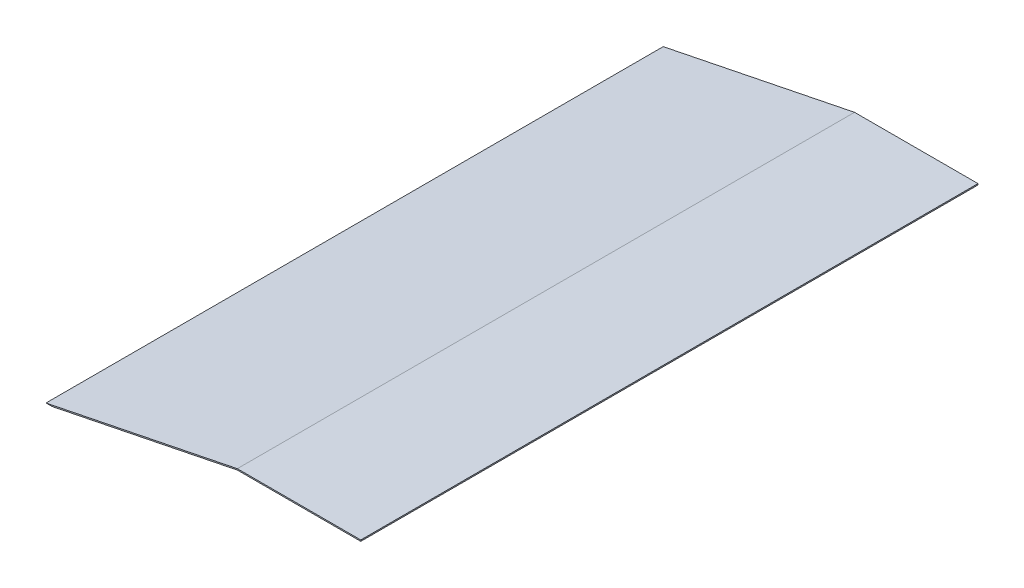
ISO-10303-21;
HEADER;
FILE_DESCRIPTION(('STEP AP214'),'2;1');
FILE_NAME('part.step','',(''),(''),'','','');
FILE_SCHEMA(('AUTOMOTIVE_DESIGN { 1 0 10303 214 1 1 1 1 }'));
ENDSEC;
DATA;
#1=APPLICATION_CONTEXT('core data for automotive mechanical design processes');
#2=APPLICATION_PROTOCOL_DEFINITION('international standard','automotive_design',2000,#1);
#3=PRODUCT_CONTEXT('',#1,'mechanical');
#4=PRODUCT('Part','Part','',(#3));
#5=PRODUCT_RELATED_PRODUCT_CATEGORY('part','',(#4));
#6=PRODUCT_DEFINITION_FORMATION('','',#4);
#7=PRODUCT_DEFINITION_CONTEXT('part definition',#1,'design');
#8=PRODUCT_DEFINITION('design','',#6,#7);
#9=PRODUCT_DEFINITION_SHAPE('','',#8);
#10=(LENGTH_UNIT() NAMED_UNIT(*) SI_UNIT(.MILLI.,.METRE.));
#11=(NAMED_UNIT(*) PLANE_ANGLE_UNIT() SI_UNIT($,.RADIAN.));
#12=(NAMED_UNIT(*) SI_UNIT($,.STERADIAN.) SOLID_ANGLE_UNIT());
#13=UNCERTAINTY_MEASURE_WITH_UNIT(LENGTH_MEASURE(1.E-05),#10,'distance_accuracy_value','');
#14=(GEOMETRIC_REPRESENTATION_CONTEXT(3) GLOBAL_UNCERTAINTY_ASSIGNED_CONTEXT((#13)) GLOBAL_UNIT_ASSIGNED_CONTEXT((#10,
#11,#12)) REPRESENTATION_CONTEXT('',''));
#15=CARTESIAN_POINT('',(0.,0.,0.));
#16=DIRECTION('',(0.,0.,1.));
#17=DIRECTION('',(1.,0.,0.));
#18=AXIS2_PLACEMENT_3D('',#15,#16,#17);
#19=CARTESIAN_POINT('',(0.,6.08130106525994,100.));
#20=DIRECTION('',(-1.,0.,0.));
#21=DIRECTION('',(0.,-1.,0.));
#22=AXIS2_PLACEMENT_3D('',#19,#20,#21);
#23=PLANE('',#22);
#24=DIRECTION('',(0.,1.,0.));
#25=VECTOR('',#24,1.);
#26=CARTESIAN_POINT('',(0.,6.08130106525994,0.));
#27=LINE('',#26,#25);
#28=CARTESIAN_POINT('',(0.,6.08130106525994,0.));
#29=VERTEX_POINT('',#28);
#30=CARTESIAN_POINT('',(0.,6.28401110076863,0.));
#31=VERTEX_POINT('',#30);
#32=EDGE_CURVE('E128',#29,#31,#27,.T.);
#33=ORIENTED_EDGE('',*,*,#32,.T.);
#34=DIRECTION('',(0.,0.,-1.));
#35=VECTOR('',#34,1.);
#36=CARTESIAN_POINT('',(0.,6.28401110076863,100.));
#37=LINE('',#36,#35);
#38=CARTESIAN_POINT('',(0.,6.28401110076863,100.));
#39=VERTEX_POINT('',#38);
#40=EDGE_CURVE('E11',#39,#31,#37,.T.);
#41=ORIENTED_EDGE('',*,*,#40,.F.);
#42=DIRECTION('',(0.,1.,0.));
#43=VECTOR('',#42,1.);
#44=CARTESIAN_POINT('',(0.,6.08130106525994,100.));
#45=LINE('',#44,#43);
#46=CARTESIAN_POINT('',(0.,6.08130106525994,100.));
#47=VERTEX_POINT('',#46);
#48=EDGE_CURVE('E144',#47,#39,#45,.T.);
#49=ORIENTED_EDGE('',*,*,#48,.F.);
#50=DIRECTION('',(0.,0.,-1.));
#51=VECTOR('',#50,1.);
#52=CARTESIAN_POINT('',(0.,6.08130106525994,100.));
#53=LINE('',#52,#51);
#54=EDGE_CURVE('E124',#47,#29,#53,.T.);
#55=ORIENTED_EDGE('',*,*,#54,.T.);
#56=EDGE_LOOP('',(#33,#41,#49,#55));
#57=FACE_BOUND('',#56,.T.);
#58=ADVANCED_FACE('F39',(#57),#23,.F.);
#59=CARTESIAN_POINT('',(0.,6.28401110076863,100.));
#60=DIRECTION('',(0.,-1.,0.));
#61=DIRECTION('',(1.,0.,0.));
#62=AXIS2_PLACEMENT_3D('',#59,#60,#61);
#63=PLANE('',#62);
#64=DIRECTION('',(-1.,0.,0.));
#65=VECTOR('',#64,1.);
#66=CARTESIAN_POINT('',(0.,6.28401110076863,0.));
#67=LINE('',#66,#65);
#68=CARTESIAN_POINT('',(-20.,6.28401110076862,0.));
#69=VERTEX_POINT('',#68);
#70=EDGE_CURVE('E132',#31,#69,#67,.T.);
#71=ORIENTED_EDGE('',*,*,#70,.T.);
#72=DIRECTION('',(0.,0.,-1.));
#73=VECTOR('',#72,1.);
#74=CARTESIAN_POINT('',(-20.,6.28401110076862,100.));
#75=LINE('',#74,#73);
#76=CARTESIAN_POINT('',(-20.,6.28401110076862,100.));
#77=VERTEX_POINT('',#76);
#78=EDGE_CURVE('E48',#77,#69,#75,.T.);
#79=ORIENTED_EDGE('',*,*,#78,.F.);
#80=DIRECTION('',(-1.,0.,0.));
#81=VECTOR('',#80,1.);
#82=CARTESIAN_POINT('',(0.,6.28401110076863,100.));
#83=LINE('',#82,#81);
#84=EDGE_CURVE('E93',#39,#77,#83,.T.);
#85=ORIENTED_EDGE('',*,*,#84,.F.);
#86=ORIENTED_EDGE('',*,*,#40,.T.);
#87=EDGE_LOOP('',(#71,#79,#85,#86));
#88=FACE_BOUND('',#87,.T.);
#89=ADVANCED_FACE('F172',(#88),#63,.F.);
#90=CARTESIAN_POINT('',(-51.,0.,100.));
#91=DIRECTION('',(0.198669330795054,-0.980066577841243,0.));
#92=DIRECTION('',(0.980066577841243,0.198669330795054,0.));
#93=AXIS2_PLACEMENT_3D('',#90,#91,#92);
#94=PLANE('',#93);
#95=DIRECTION('',(-0.980066577841243,-0.198669330795054,0.));
#96=VECTOR('',#95,1.);
#97=CARTESIAN_POINT('',(-51.,0.,0.));
#98=LINE('',#97,#96);
#99=CARTESIAN_POINT('',(-51.,0.,0.));
#100=VERTEX_POINT('',#99);
#101=EDGE_CURVE('E135',#69,#100,#98,.T.);
#102=ORIENTED_EDGE('',*,*,#101,.T.);
#103=DIRECTION('',(0.,0.,-1.));
#104=VECTOR('',#103,1.);
#105=CARTESIAN_POINT('',(-51.,0.,100.));
#106=LINE('',#105,#104);
#107=CARTESIAN_POINT('',(-51.,0.,100.));
#108=VERTEX_POINT('',#107);
#109=EDGE_CURVE('E117',#108,#100,#106,.T.);
#110=ORIENTED_EDGE('',*,*,#109,.F.);
#111=DIRECTION('',(-0.980066577841243,-0.198669330795054,0.));
#112=VECTOR('',#111,1.);
#113=CARTESIAN_POINT('',(-51.,0.,100.));
#114=LINE('',#113,#112);
#115=EDGE_CURVE('E106',#77,#108,#114,.T.);
#116=ORIENTED_EDGE('',*,*,#115,.F.);
#117=ORIENTED_EDGE('',*,*,#78,.T.);
#118=EDGE_LOOP('',(#102,#110,#116,#117));
#119=FACE_BOUND('',#118,.T.);
#120=ADVANCED_FACE('F154',(#119),#94,.F.);
#121=CARTESIAN_POINT('',(-50.,0.,100.));
#122=DIRECTION('',(0.,1.,0.));
#123=DIRECTION('',(-1.,0.,0.));
#124=AXIS2_PLACEMENT_3D('',#121,#122,#123);
#125=PLANE('',#124);
#126=DIRECTION('',(1.,0.,0.));
#127=VECTOR('',#126,1.);
#128=CARTESIAN_POINT('',(-50.,0.,0.));
#129=LINE('',#128,#127);
#130=CARTESIAN_POINT('',(-50.,0.,0.));
#131=VERTEX_POINT('',#130);
#132=EDGE_CURVE('E115',#100,#131,#129,.T.);
#133=ORIENTED_EDGE('',*,*,#132,.T.);
#134=DIRECTION('',(0.,0.,-1.));
#135=VECTOR('',#134,1.);
#136=CARTESIAN_POINT('',(-50.,0.,100.));
#137=LINE('',#136,#135);
#138=CARTESIAN_POINT('',(-50.,0.,100.));
#139=VERTEX_POINT('',#138);
#140=EDGE_CURVE('E112',#139,#131,#137,.T.);
#141=ORIENTED_EDGE('',*,*,#140,.F.);
#142=DIRECTION('',(1.,0.,0.));
#143=VECTOR('',#142,1.);
#144=CARTESIAN_POINT('',(-50.,0.,100.));
#145=LINE('',#144,#143);
#146=EDGE_CURVE('E100',#108,#139,#145,.T.);
#147=ORIENTED_EDGE('',*,*,#146,.F.);
#148=ORIENTED_EDGE('',*,*,#109,.T.);
#149=EDGE_LOOP('',(#133,#141,#147,#148));
#150=FACE_BOUND('',#149,.T.);
#151=ADVANCED_FACE('F113',(#150),#125,.F.);
#152=CARTESIAN_POINT('',(-50.,0.,100.));
#153=DIRECTION('',(-0.198669330795054,0.980066577841243,0.));
#154=DIRECTION('',(-0.980066577841243,-0.198669330795054,0.));
#155=AXIS2_PLACEMENT_3D('',#152,#153,#154);
#156=PLANE('',#155);
#157=DIRECTION('',(0.980066577841243,0.198669330795054,0.));
#158=VECTOR('',#157,1.);
#159=CARTESIAN_POINT('',(-50.,0.,0.));
#160=LINE('',#159,#158);
#161=CARTESIAN_POINT('',(-20.,6.08130106525995,0.));
#162=VERTEX_POINT('',#161);
#163=EDGE_CURVE('E79',#131,#162,#160,.T.);
#164=ORIENTED_EDGE('',*,*,#163,.T.);
#165=DIRECTION('',(0.,0.,-1.));
#166=VECTOR('',#165,1.);
#167=CARTESIAN_POINT('',(-20.,6.08130106525995,100.));
#168=LINE('',#167,#166);
#169=CARTESIAN_POINT('',(-20.,6.08130106525995,100.));
#170=VERTEX_POINT('',#169);
#171=EDGE_CURVE('E118',#170,#162,#168,.T.);
#172=ORIENTED_EDGE('',*,*,#171,.F.);
#173=DIRECTION('',(0.980066577841243,0.198669330795054,0.));
#174=VECTOR('',#173,1.);
#175=CARTESIAN_POINT('',(-50.,0.,100.));
#176=LINE('',#175,#174);
#177=EDGE_CURVE('E104',#139,#170,#176,.T.);
#178=ORIENTED_EDGE('',*,*,#177,.F.);
#179=ORIENTED_EDGE('',*,*,#140,.T.);
#180=EDGE_LOOP('',(#164,#172,#178,#179));
#181=FACE_BOUND('',#180,.T.);
#182=ADVANCED_FACE('F120',(#181),#156,.F.);
#183=CARTESIAN_POINT('',(-20.,6.08130106525995,100.));
#184=DIRECTION('',(0.,1.,0.));
#185=DIRECTION('',(-1.,0.,0.));
#186=AXIS2_PLACEMENT_3D('',#183,#184,#185);
#187=PLANE('',#186);
#188=DIRECTION('',(1.,0.,0.));
#189=VECTOR('',#188,1.);
#190=CARTESIAN_POINT('',(-20.,6.08130106525995,0.));
#191=LINE('',#190,#189);
#192=EDGE_CURVE('E85',#162,#29,#191,.T.);
#193=ORIENTED_EDGE('',*,*,#192,.T.);
#194=ORIENTED_EDGE('',*,*,#54,.F.);
#195=DIRECTION('',(1.,0.,0.));
#196=VECTOR('',#195,1.);
#197=CARTESIAN_POINT('',(-20.,6.08130106525995,100.));
#198=LINE('',#197,#196);
#199=EDGE_CURVE('E56',#170,#47,#198,.T.);
#200=ORIENTED_EDGE('',*,*,#199,.F.);
#201=ORIENTED_EDGE('',*,*,#171,.T.);
#202=EDGE_LOOP('',(#193,#194,#200,#201));
#203=FACE_BOUND('',#202,.T.);
#204=ADVANCED_FACE('F161',(#203),#187,.F.);
#205=CARTESIAN_POINT('',(0.,0.,100.));
#206=DIRECTION('',(0.,0.,1.));
#207=DIRECTION('',(1.,0.,0.));
#208=AXIS2_PLACEMENT_3D('',#205,#206,#207);
#209=PLANE('',#208);
#210=ORIENTED_EDGE('',*,*,#48,.T.);
#211=ORIENTED_EDGE('',*,*,#84,.T.);
#212=ORIENTED_EDGE('',*,*,#115,.T.);
#213=ORIENTED_EDGE('',*,*,#146,.T.);
#214=ORIENTED_EDGE('',*,*,#177,.T.);
#215=ORIENTED_EDGE('',*,*,#199,.T.);
#216=EDGE_LOOP('',(#210,#211,#212,#213,#214,#215));
#217=FACE_BOUND('',#216,.T.);
#218=ADVANCED_FACE('F102',(#217),#209,.T.);
#219=CARTESIAN_POINT('',(0.,0.,0.));
#220=DIRECTION('',(0.,0.,1.));
#221=DIRECTION('',(1.,0.,0.));
#222=AXIS2_PLACEMENT_3D('',#219,#220,#221);
#223=PLANE('',#222);
#224=ORIENTED_EDGE('',*,*,#32,.F.);
#225=ORIENTED_EDGE('',*,*,#192,.F.);
#226=ORIENTED_EDGE('',*,*,#163,.F.);
#227=ORIENTED_EDGE('',*,*,#132,.F.);
#228=ORIENTED_EDGE('',*,*,#101,.F.);
#229=ORIENTED_EDGE('',*,*,#70,.F.);
#230=EDGE_LOOP('',(#224,#225,#226,#227,#228,#229));
#231=FACE_BOUND('',#230,.T.);
#232=ADVANCED_FACE('F157',(#231),#223,.F.);
#233=CLOSED_SHELL('',(#58,#89,#120,#151,#182,#204,#218,#232));
#234=MANIFOLD_SOLID_BREP('B2',#233);
#235=ADVANCED_BREP_SHAPE_REPRESENTATION('',(#18,#234),#14);
#236=SHAPE_DEFINITION_REPRESENTATION(#9,#235);
ENDSEC;
END-ISO-10303-21;
